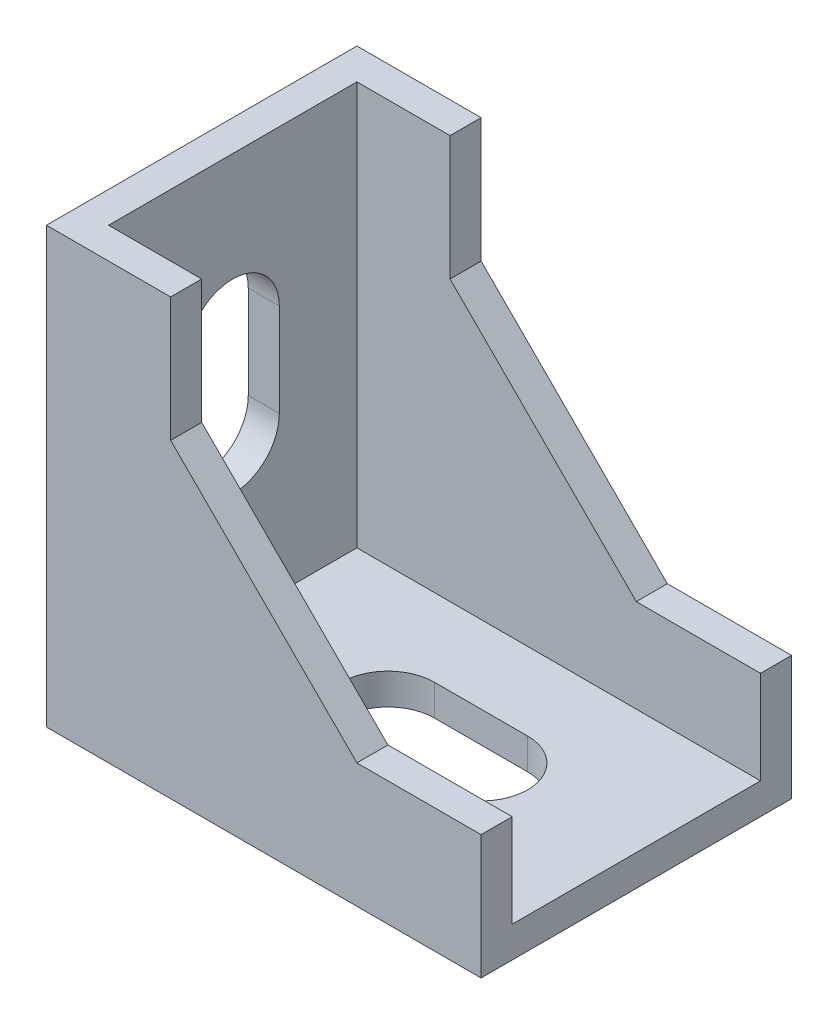
ISO-10303-21;
HEADER;
FILE_DESCRIPTION(('STEP AP214'),'2;1');
FILE_NAME('part.step','',(''),(''),'','','');
FILE_SCHEMA(('AUTOMOTIVE_DESIGN { 1 0 10303 214 1 1 1 1 }'));
ENDSEC;
DATA;
#1=APPLICATION_CONTEXT('core data for automotive mechanical design processes');
#2=APPLICATION_PROTOCOL_DEFINITION('international standard','automotive_design',2000,#1);
#3=PRODUCT_CONTEXT('',#1,'mechanical');
#4=PRODUCT('Part','Part','',(#3));
#5=PRODUCT_RELATED_PRODUCT_CATEGORY('part','',(#4));
#6=PRODUCT_DEFINITION_FORMATION('','',#4);
#7=PRODUCT_DEFINITION_CONTEXT('part definition',#1,'design');
#8=PRODUCT_DEFINITION('design','',#6,#7);
#9=PRODUCT_DEFINITION_SHAPE('','',#8);
#10=(LENGTH_UNIT() NAMED_UNIT(*) SI_UNIT(.MILLI.,.METRE.));
#11=(NAMED_UNIT(*) PLANE_ANGLE_UNIT() SI_UNIT($,.RADIAN.));
#12=(NAMED_UNIT(*) SI_UNIT($,.STERADIAN.) SOLID_ANGLE_UNIT());
#13=UNCERTAINTY_MEASURE_WITH_UNIT(LENGTH_MEASURE(1.E-05),#10,'distance_accuracy_value','');
#14=(GEOMETRIC_REPRESENTATION_CONTEXT(3) GLOBAL_UNCERTAINTY_ASSIGNED_CONTEXT((#13)) GLOBAL_UNIT_ASSIGNED_CONTEXT((#10,
#11,#12)) REPRESENTATION_CONTEXT('',''));
#15=CARTESIAN_POINT('',(0.,0.,0.));
#16=DIRECTION('',(0.,0.,1.));
#17=DIRECTION('',(1.,0.,0.));
#18=AXIS2_PLACEMENT_3D('',#15,#16,#17);
#19=CARTESIAN_POINT('',(28.,8.,20.));
#20=DIRECTION('',(-1.,0.,0.));
#21=DIRECTION('',(0.,-1.,0.));
#22=AXIS2_PLACEMENT_3D('',#19,#20,#21);
#23=PLANE('',#22);
#24=DIRECTION('',(0.,-1.,0.));
#25=VECTOR('',#24,1.);
#26=CARTESIAN_POINT('',(28.,0.,2.));
#27=LINE('',#26,#25);
#28=CARTESIAN_POINT('',(28.,8.,2.));
#29=VERTEX_POINT('',#28);
#30=CARTESIAN_POINT('',(28.,2.,2.));
#31=VERTEX_POINT('',#30);
#32=EDGE_CURVE('E290',#29,#31,#27,.T.);
#33=ORIENTED_EDGE('',*,*,#32,.T.);
#34=DIRECTION('',(0.,0.,-1.));
#35=VECTOR('',#34,1.);
#36=CARTESIAN_POINT('',(28.,2.,0.));
#37=LINE('',#36,#35);
#38=CARTESIAN_POINT('',(28.,2.,18.));
#39=VERTEX_POINT('',#38);
#40=EDGE_CURVE('E281',#39,#31,#37,.T.);
#41=ORIENTED_EDGE('',*,*,#40,.F.);
#42=DIRECTION('',(0.,-1.,0.));
#43=VECTOR('',#42,1.);
#44=CARTESIAN_POINT('',(28.,0.,18.));
#45=LINE('',#44,#43);
#46=CARTESIAN_POINT('',(28.,8.,18.));
#47=VERTEX_POINT('',#46);
#48=EDGE_CURVE('E286',#47,#39,#45,.T.);
#49=ORIENTED_EDGE('',*,*,#48,.F.);
#50=DIRECTION('',(0.,0.,-1.));
#51=VECTOR('',#50,1.);
#52=CARTESIAN_POINT('',(28.,8.,20.));
#53=LINE('',#52,#51);
#54=CARTESIAN_POINT('',(28.,8.,20.));
#55=VERTEX_POINT('',#54);
#56=EDGE_CURVE('E54',#55,#47,#53,.T.);
#57=ORIENTED_EDGE('',*,*,#56,.F.);
#58=DIRECTION('',(0.,1.,0.));
#59=VECTOR('',#58,1.);
#60=CARTESIAN_POINT('',(28.,8.,20.));
#61=LINE('',#60,#59);
#62=CARTESIAN_POINT('',(28.,0.,20.));
#63=VERTEX_POINT('',#62);
#64=EDGE_CURVE('E345',#63,#55,#61,.T.);
#65=ORIENTED_EDGE('',*,*,#64,.F.);
#66=DIRECTION('',(0.,0.,-1.));
#67=VECTOR('',#66,1.);
#68=CARTESIAN_POINT('',(28.,0.,20.));
#69=LINE('',#68,#67);
#70=CARTESIAN_POINT('',(28.,0.,0.));
#71=VERTEX_POINT('',#70);
#72=EDGE_CURVE('E11',#63,#71,#69,.T.);
#73=ORIENTED_EDGE('',*,*,#72,.T.);
#74=DIRECTION('',(0.,1.,0.));
#75=VECTOR('',#74,1.);
#76=CARTESIAN_POINT('',(28.,8.,0.));
#77=LINE('',#76,#75);
#78=CARTESIAN_POINT('',(28.,8.,0.));
#79=VERTEX_POINT('',#78);
#80=EDGE_CURVE('E368',#71,#79,#77,.T.);
#81=ORIENTED_EDGE('',*,*,#80,.T.);
#82=EDGE_CURVE('E410',#29,#79,#53,.T.);
#83=ORIENTED_EDGE('',*,*,#82,.F.);
#84=EDGE_LOOP('',(#33,#41,#49,#57,#65,#73,#81,#83));
#85=FACE_BOUND('',#84,.T.);
#86=ADVANCED_FACE('F45',(#85),#23,.F.);
#87=CARTESIAN_POINT('',(20.,8.,20.));
#88=DIRECTION('',(0.,-1.,0.));
#89=DIRECTION('',(1.,0.,0.));
#90=AXIS2_PLACEMENT_3D('',#87,#88,#89);
#91=PLANE('',#90);
#92=DIRECTION('',(-1.,0.,0.));
#93=VECTOR('',#92,1.);
#94=CARTESIAN_POINT('',(20.,8.,2.));
#95=LINE('',#94,#93);
#96=CARTESIAN_POINT('',(20.,8.,2.));
#97=VERTEX_POINT('',#96);
#98=EDGE_CURVE('E337',#29,#97,#95,.T.);
#99=ORIENTED_EDGE('',*,*,#98,.F.);
#100=ORIENTED_EDGE('',*,*,#82,.T.);
#101=DIRECTION('',(-1.,0.,0.));
#102=VECTOR('',#101,1.);
#103=CARTESIAN_POINT('',(20.,8.,0.));
#104=LINE('',#103,#102);
#105=CARTESIAN_POINT('',(20.,8.,0.));
#106=VERTEX_POINT('',#105);
#107=EDGE_CURVE('E372',#79,#106,#104,.T.);
#108=ORIENTED_EDGE('',*,*,#107,.T.);
#109=DIRECTION('',(0.,0.,-1.));
#110=VECTOR('',#109,1.);
#111=CARTESIAN_POINT('',(20.,8.,20.));
#112=LINE('',#111,#110);
#113=EDGE_CURVE('E406',#97,#106,#112,.T.);
#114=ORIENTED_EDGE('',*,*,#113,.F.);
#115=EDGE_LOOP('',(#99,#100,#108,#114));
#116=FACE_BOUND('',#115,.T.);
#117=ADVANCED_FACE('F420',(#116),#91,.F.);
#118=CARTESIAN_POINT('',(8.,20.,20.));
#119=DIRECTION('',(-0.707106781186548,-0.707106781186547,0.));
#120=DIRECTION('',(0.707106781186547,-0.707106781186548,0.));
#121=AXIS2_PLACEMENT_3D('',#118,#119,#120);
#122=PLANE('',#121);
#123=DIRECTION('',(-0.707106781186547,0.707106781186548,0.));
#124=VECTOR('',#123,1.);
#125=CARTESIAN_POINT('',(8.,20.,2.));
#126=LINE('',#125,#124);
#127=CARTESIAN_POINT('',(8.,20.,2.));
#128=VERTEX_POINT('',#127);
#129=EDGE_CURVE('E334',#97,#128,#126,.T.);
#130=ORIENTED_EDGE('',*,*,#129,.F.);
#131=ORIENTED_EDGE('',*,*,#113,.T.);
#132=DIRECTION('',(-0.707106781186547,0.707106781186548,0.));
#133=VECTOR('',#132,1.);
#134=CARTESIAN_POINT('',(8.,20.,0.));
#135=LINE('',#134,#133);
#136=CARTESIAN_POINT('',(8.,20.,0.));
#137=VERTEX_POINT('',#136);
#138=EDGE_CURVE('E376',#106,#137,#135,.T.);
#139=ORIENTED_EDGE('',*,*,#138,.T.);
#140=DIRECTION('',(0.,0.,-1.));
#141=VECTOR('',#140,1.);
#142=CARTESIAN_POINT('',(8.,20.,20.));
#143=LINE('',#142,#141);
#144=EDGE_CURVE('E401',#128,#137,#143,.T.);
#145=ORIENTED_EDGE('',*,*,#144,.F.);
#146=EDGE_LOOP('',(#130,#131,#139,#145));
#147=FACE_BOUND('',#146,.T.);
#148=ADVANCED_FACE('F434',(#147),#122,.F.);
#149=CARTESIAN_POINT('',(8.,28.,20.));
#150=DIRECTION('',(-1.,0.,0.));
#151=DIRECTION('',(0.,0.,1.));
#152=AXIS2_PLACEMENT_3D('',#149,#150,#151);
#153=PLANE('',#152);
#154=DIRECTION('',(0.,1.,0.));
#155=VECTOR('',#154,1.);
#156=CARTESIAN_POINT('',(8.,28.,2.));
#157=LINE('',#156,#155);
#158=CARTESIAN_POINT('',(7.99999999999999,28.,2.));
#159=VERTEX_POINT('',#158);
#160=EDGE_CURVE('E331',#128,#159,#157,.T.);
#161=ORIENTED_EDGE('',*,*,#160,.F.);
#162=ORIENTED_EDGE('',*,*,#144,.T.);
#163=DIRECTION('',(0.,1.,0.));
#164=VECTOR('',#163,1.);
#165=CARTESIAN_POINT('',(8.,28.,0.));
#166=LINE('',#165,#164);
#167=CARTESIAN_POINT('',(8.,28.,0.));
#168=VERTEX_POINT('',#167);
#169=EDGE_CURVE('E380',#137,#168,#166,.T.);
#170=ORIENTED_EDGE('',*,*,#169,.T.);
#171=DIRECTION('',(0.,0.,-1.));
#172=VECTOR('',#171,1.);
#173=CARTESIAN_POINT('',(8.,28.,20.));
#174=LINE('',#173,#172);
#175=EDGE_CURVE('E396',#159,#168,#174,.T.);
#176=ORIENTED_EDGE('',*,*,#175,.F.);
#177=EDGE_LOOP('',(#161,#162,#170,#176));
#178=FACE_BOUND('',#177,.T.);
#179=ADVANCED_FACE('F445',(#178),#153,.F.);
#180=CARTESIAN_POINT('',(0.,28.,20.));
#181=DIRECTION('',(0.,-1.,0.));
#182=DIRECTION('',(1.,0.,0.));
#183=AXIS2_PLACEMENT_3D('',#180,#181,#182);
#184=PLANE('',#183);
#185=DIRECTION('',(1.,0.,0.));
#186=VECTOR('',#185,1.);
#187=CARTESIAN_POINT('',(-28.5286749809475,28.,2.));
#188=LINE('',#187,#186);
#189=CARTESIAN_POINT('',(2.000000064,28.,2.));
#190=VERTEX_POINT('',#189);
#191=EDGE_CURVE('E250',#190,#159,#188,.T.);
#192=ORIENTED_EDGE('',*,*,#191,.T.);
#193=ORIENTED_EDGE('',*,*,#175,.T.);
#194=DIRECTION('',(-1.,0.,0.));
#195=VECTOR('',#194,1.);
#196=CARTESIAN_POINT('',(0.,28.,0.));
#197=LINE('',#196,#195);
#198=CARTESIAN_POINT('',(0.,28.,0.));
#199=VERTEX_POINT('',#198);
#200=EDGE_CURVE('E384',#168,#199,#197,.T.);
#201=ORIENTED_EDGE('',*,*,#200,.T.);
#202=DIRECTION('',(0.,0.,-1.));
#203=VECTOR('',#202,1.);
#204=CARTESIAN_POINT('',(0.,28.,20.));
#205=LINE('',#204,#203);
#206=CARTESIAN_POINT('',(0.,28.,20.));
#207=VERTEX_POINT('',#206);
#208=EDGE_CURVE('E392',#207,#199,#205,.T.);
#209=ORIENTED_EDGE('',*,*,#208,.F.);
#210=DIRECTION('',(-1.,0.,0.));
#211=VECTOR('',#210,1.);
#212=CARTESIAN_POINT('',(0.,28.,20.));
#213=LINE('',#212,#211);
#214=CARTESIAN_POINT('',(8.,28.,20.));
#215=VERTEX_POINT('',#214);
#216=EDGE_CURVE('E358',#215,#207,#213,.T.);
#217=ORIENTED_EDGE('',*,*,#216,.F.);
#218=CARTESIAN_POINT('',(7.99999999999999,28.,18.));
#219=VERTEX_POINT('',#218);
#220=EDGE_CURVE('E397',#215,#219,#174,.T.);
#221=ORIENTED_EDGE('',*,*,#220,.T.);
#222=DIRECTION('',(1.,0.,0.));
#223=VECTOR('',#222,1.);
#224=CARTESIAN_POINT('',(-28.5286749809475,28.,18.));
#225=LINE('',#224,#223);
#226=CARTESIAN_POINT('',(2.00000006399999,28.,18.));
#227=VERTEX_POINT('',#226);
#228=EDGE_CURVE('E289',#227,#219,#225,.T.);
#229=ORIENTED_EDGE('',*,*,#228,.F.);
#230=DIRECTION('',(0.,0.,-1.));
#231=VECTOR('',#230,1.);
#232=CARTESIAN_POINT('',(2.000000064,28.,0.));
#233=LINE('',#232,#231);
#234=EDGE_CURVE('E285',#227,#190,#233,.T.);
#235=ORIENTED_EDGE('',*,*,#234,.T.);
#236=EDGE_LOOP('',(#192,#193,#201,#209,#217,#221,#229,#235));
#237=FACE_BOUND('',#236,.T.);
#238=ADVANCED_FACE('F440',(#237),#184,.F.);
#239=CARTESIAN_POINT('',(0.,0.,20.));
#240=DIRECTION('',(0.,1.,0.));
#241=DIRECTION('',(0.,0.,1.));
#242=AXIS2_PLACEMENT_3D('',#239,#240,#241);
#243=PLANE('',#242);
#244=DIRECTION('',(1.,0.,0.));
#245=VECTOR('',#244,1.);
#246=CARTESIAN_POINT('',(0.,0.,7.));
#247=LINE('',#246,#245);
#248=CARTESIAN_POINT('',(12.,-1.25233157177718E-13,7.));
#249=VERTEX_POINT('',#248);
#250=CARTESIAN_POINT('',(18.,-1.87849735766576E-13,7.));
#251=VERTEX_POINT('',#250);
#252=EDGE_CURVE('E234',#249,#251,#247,.T.);
#253=ORIENTED_EDGE('',*,*,#252,.F.);
#254=CARTESIAN_POINT('',(12.,-1.25233157177718E-13,10.));
#255=DIRECTION('',(0.,-1.,0.));
#256=DIRECTION('',(0.,0.,-1.));
#257=AXIS2_PLACEMENT_3D('',#254,#255,#256);
#258=CIRCLE('',#257,3.);
#259=CARTESIAN_POINT('',(12.,0.,13.));
#260=VERTEX_POINT('',#259);
#261=EDGE_CURVE('E204',#260,#249,#258,.T.);
#262=ORIENTED_EDGE('',*,*,#261,.F.);
#263=DIRECTION('',(1.,0.,0.));
#264=VECTOR('',#263,1.);
#265=CARTESIAN_POINT('',(0.,0.,13.));
#266=LINE('',#265,#264);
#267=CARTESIAN_POINT('',(18.,-1.87849735766576E-13,13.));
#268=VERTEX_POINT('',#267);
#269=EDGE_CURVE('E61',#260,#268,#266,.T.);
#270=ORIENTED_EDGE('',*,*,#269,.T.);
#271=CARTESIAN_POINT('',(18.,-1.87849735766576E-13,10.));
#272=DIRECTION('',(0.,-1.,0.));
#273=DIRECTION('',(0.,0.,-1.));
#274=AXIS2_PLACEMENT_3D('',#271,#272,#273);
#275=CIRCLE('',#274,3.);
#276=EDGE_CURVE('E217',#268,#251,#275,.F.);
#277=ORIENTED_EDGE('',*,*,#276,.T.);
#278=EDGE_LOOP('',(#253,#262,#270,#277));
#279=FACE_BOUND('',#278,.T.);
#280=DIRECTION('',(1.,0.,0.));
#281=VECTOR('',#280,1.);
#282=CARTESIAN_POINT('',(0.,0.,0.));
#283=LINE('',#282,#281);
#284=CARTESIAN_POINT('',(0.,0.,0.));
#285=VERTEX_POINT('',#284);
#286=EDGE_CURVE('E340',#285,#71,#283,.T.);
#287=ORIENTED_EDGE('',*,*,#286,.T.);
#288=ORIENTED_EDGE('',*,*,#72,.F.);
#289=DIRECTION('',(1.,0.,0.));
#290=VECTOR('',#289,1.);
#291=CARTESIAN_POINT('',(0.,0.,20.));
#292=LINE('',#291,#290);
#293=CARTESIAN_POINT('',(0.,0.,20.));
#294=VERTEX_POINT('',#293);
#295=EDGE_CURVE('E341',#294,#63,#292,.T.);
#296=ORIENTED_EDGE('',*,*,#295,.F.);
#297=DIRECTION('',(0.,0.,-1.));
#298=VECTOR('',#297,1.);
#299=CARTESIAN_POINT('',(0.,0.,20.));
#300=LINE('',#299,#298);
#301=EDGE_CURVE('E364',#294,#285,#300,.T.);
#302=ORIENTED_EDGE('',*,*,#301,.T.);
#303=EDGE_LOOP('',(#287,#288,#296,#302));
#304=FACE_BOUND('',#303,.T.);
#305=ADVANCED_FACE('F47',(#279,#304),#243,.F.);
#306=ORIENTED_EDGE('',*,*,#56,.T.);
#307=DIRECTION('',(-1.,0.,0.));
#308=VECTOR('',#307,1.);
#309=CARTESIAN_POINT('',(20.,8.,18.));
#310=LINE('',#309,#308);
#311=CARTESIAN_POINT('',(20.,8.,18.));
#312=VERTEX_POINT('',#311);
#313=EDGE_CURVE('E327',#47,#312,#310,.T.);
#314=ORIENTED_EDGE('',*,*,#313,.T.);
#315=CARTESIAN_POINT('',(20.,8.,20.));
#316=VERTEX_POINT('',#315);
#317=EDGE_CURVE('E407',#316,#312,#112,.T.);
#318=ORIENTED_EDGE('',*,*,#317,.F.);
#319=DIRECTION('',(-1.,0.,0.));
#320=VECTOR('',#319,1.);
#321=CARTESIAN_POINT('',(20.,8.,20.));
#322=LINE('',#321,#320);
#323=EDGE_CURVE('E349',#55,#316,#322,.T.);
#324=ORIENTED_EDGE('',*,*,#323,.F.);
#325=EDGE_LOOP('',(#306,#314,#318,#324));
#326=FACE_BOUND('',#325,.T.);
#327=ADVANCED_FACE('F469',(#326),#91,.F.);
#328=ORIENTED_EDGE('',*,*,#317,.T.);
#329=DIRECTION('',(-0.707106781186547,0.707106781186548,0.));
#330=VECTOR('',#329,1.);
#331=CARTESIAN_POINT('',(8.,20.,18.));
#332=LINE('',#331,#330);
#333=CARTESIAN_POINT('',(8.,20.,18.));
#334=VERTEX_POINT('',#333);
#335=EDGE_CURVE('E323',#312,#334,#332,.T.);
#336=ORIENTED_EDGE('',*,*,#335,.T.);
#337=CARTESIAN_POINT('',(8.,20.,20.));
#338=VERTEX_POINT('',#337);
#339=EDGE_CURVE('E402',#338,#334,#143,.T.);
#340=ORIENTED_EDGE('',*,*,#339,.F.);
#341=DIRECTION('',(-0.707106781186547,0.707106781186548,0.));
#342=VECTOR('',#341,1.);
#343=CARTESIAN_POINT('',(8.,20.,20.));
#344=LINE('',#343,#342);
#345=EDGE_CURVE('E352',#316,#338,#344,.T.);
#346=ORIENTED_EDGE('',*,*,#345,.F.);
#347=EDGE_LOOP('',(#328,#336,#340,#346));
#348=FACE_BOUND('',#347,.T.);
#349=ADVANCED_FACE('F466',(#348),#122,.F.);
#350=ORIENTED_EDGE('',*,*,#339,.T.);
#351=DIRECTION('',(0.,1.,0.));
#352=VECTOR('',#351,1.);
#353=CARTESIAN_POINT('',(8.,28.,18.));
#354=LINE('',#353,#352);
#355=EDGE_CURVE('E306',#334,#219,#354,.T.);
#356=ORIENTED_EDGE('',*,*,#355,.T.);
#357=ORIENTED_EDGE('',*,*,#220,.F.);
#358=DIRECTION('',(0.,1.,0.));
#359=VECTOR('',#358,1.);
#360=CARTESIAN_POINT('',(8.,28.,20.));
#361=LINE('',#360,#359);
#362=EDGE_CURVE('E355',#338,#215,#361,.T.);
#363=ORIENTED_EDGE('',*,*,#362,.F.);
#364=EDGE_LOOP('',(#350,#356,#357,#363));
#365=FACE_BOUND('',#364,.T.);
#366=ADVANCED_FACE('F460',(#365),#153,.F.);
#367=CARTESIAN_POINT('',(0.,0.,20.));
#368=DIRECTION('',(1.,0.,0.));
#369=DIRECTION('',(0.,0.,-1.));
#370=AXIS2_PLACEMENT_3D('',#367,#368,#369);
#371=PLANE('',#370);
#372=DIRECTION('',(0.,1.,0.));
#373=VECTOR('',#372,1.);
#374=CARTESIAN_POINT('',(0.,0.,7.));
#375=LINE('',#374,#373);
#376=CARTESIAN_POINT('',(0.,12.,7.));
#377=VERTEX_POINT('',#376);
#378=CARTESIAN_POINT('',(0.,18.,7.));
#379=VERTEX_POINT('',#378);
#380=EDGE_CURVE('E243',#377,#379,#375,.T.);
#381=ORIENTED_EDGE('',*,*,#380,.T.);
#382=CARTESIAN_POINT('',(0.,18.,10.));
#383=DIRECTION('',(1.,0.,0.));
#384=DIRECTION('',(0.,0.,-1.));
#385=AXIS2_PLACEMENT_3D('',#382,#383,#384);
#386=CIRCLE('',#385,3.);
#387=CARTESIAN_POINT('',(0.,18.,13.));
#388=VERTEX_POINT('',#387);
#389=EDGE_CURVE('E239',#388,#379,#386,.F.);
#390=ORIENTED_EDGE('',*,*,#389,.F.);
#391=DIRECTION('',(0.,1.,0.));
#392=VECTOR('',#391,1.);
#393=CARTESIAN_POINT('',(0.,0.,13.));
#394=LINE('',#393,#392);
#395=CARTESIAN_POINT('',(0.,12.,13.));
#396=VERTEX_POINT('',#395);
#397=EDGE_CURVE('E242',#396,#388,#394,.T.);
#398=ORIENTED_EDGE('',*,*,#397,.F.);
#399=CARTESIAN_POINT('',(0.,12.,10.));
#400=DIRECTION('',(1.,0.,0.));
#401=DIRECTION('',(0.,0.,-1.));
#402=AXIS2_PLACEMENT_3D('',#399,#400,#401);
#403=CIRCLE('',#402,3.);
#404=EDGE_CURVE('E246',#396,#377,#403,.T.);
#405=ORIENTED_EDGE('',*,*,#404,.T.);
#406=EDGE_LOOP('',(#381,#390,#398,#405));
#407=FACE_BOUND('',#406,.T.);
#408=DIRECTION('',(0.,-1.,0.));
#409=VECTOR('',#408,1.);
#410=CARTESIAN_POINT('',(0.,0.,0.));
#411=LINE('',#410,#409);
#412=EDGE_CURVE('E346',#199,#285,#411,.T.);
#413=ORIENTED_EDGE('',*,*,#412,.T.);
#414=ORIENTED_EDGE('',*,*,#301,.F.);
#415=DIRECTION('',(0.,-1.,0.));
#416=VECTOR('',#415,1.);
#417=CARTESIAN_POINT('',(0.,0.,20.));
#418=LINE('',#417,#416);
#419=EDGE_CURVE('E361',#207,#294,#418,.T.);
#420=ORIENTED_EDGE('',*,*,#419,.F.);
#421=ORIENTED_EDGE('',*,*,#208,.T.);
#422=EDGE_LOOP('',(#413,#414,#420,#421));
#423=FACE_BOUND('',#422,.T.);
#424=ADVANCED_FACE('F449',(#407,#423),#371,.F.);
#425=CARTESIAN_POINT('',(0.,0.,20.));
#426=DIRECTION('',(0.,0.,-1.));
#427=DIRECTION('',(-1.,0.,0.));
#428=AXIS2_PLACEMENT_3D('',#425,#426,#427);
#429=PLANE('',#428);
#430=ORIENTED_EDGE('',*,*,#295,.T.);
#431=ORIENTED_EDGE('',*,*,#64,.T.);
#432=ORIENTED_EDGE('',*,*,#323,.T.);
#433=ORIENTED_EDGE('',*,*,#345,.T.);
#434=ORIENTED_EDGE('',*,*,#362,.T.);
#435=ORIENTED_EDGE('',*,*,#216,.T.);
#436=ORIENTED_EDGE('',*,*,#419,.T.);
#437=EDGE_LOOP('',(#430,#431,#432,#433,#434,#435,#436));
#438=FACE_BOUND('',#437,.T.);
#439=ADVANCED_FACE('F454',(#438),#429,.F.);
#440=CARTESIAN_POINT('',(0.,0.,0.));
#441=DIRECTION('',(0.,0.,-1.));
#442=DIRECTION('',(-1.,0.,0.));
#443=AXIS2_PLACEMENT_3D('',#440,#441,#442);
#444=PLANE('',#443);
#445=ORIENTED_EDGE('',*,*,#286,.F.);
#446=ORIENTED_EDGE('',*,*,#412,.F.);
#447=ORIENTED_EDGE('',*,*,#200,.F.);
#448=ORIENTED_EDGE('',*,*,#169,.F.);
#449=ORIENTED_EDGE('',*,*,#138,.F.);
#450=ORIENTED_EDGE('',*,*,#107,.F.);
#451=ORIENTED_EDGE('',*,*,#80,.F.);
#452=EDGE_LOOP('',(#445,#446,#447,#448,#449,#450,#451));
#453=FACE_BOUND('',#452,.T.);
#454=ADVANCED_FACE('F428',(#453),#444,.T.);
#455=CARTESIAN_POINT('',(-28.5286749809475,0.,2.));
#456=DIRECTION('',(0.,0.,1.));
#457=DIRECTION('',(0.,-1.,0.));
#458=AXIS2_PLACEMENT_3D('',#455,#456,#457);
#459=PLANE('',#458);
#460=ORIENTED_EDGE('',*,*,#98,.T.);
#461=ORIENTED_EDGE('',*,*,#129,.T.);
#462=ORIENTED_EDGE('',*,*,#160,.T.);
#463=ORIENTED_EDGE('',*,*,#191,.F.);
#464=DIRECTION('',(0.,-1.,0.));
#465=VECTOR('',#464,1.);
#466=CARTESIAN_POINT('',(2.000000064,0.,2.));
#467=LINE('',#466,#465);
#468=CARTESIAN_POINT('',(2.00000006399999,1.99999999999999,2.));
#469=VERTEX_POINT('',#468);
#470=EDGE_CURVE('E302',#190,#469,#467,.T.);
#471=ORIENTED_EDGE('',*,*,#470,.T.);
#472=DIRECTION('',(1.,0.,0.));
#473=VECTOR('',#472,1.);
#474=CARTESIAN_POINT('',(-28.5286749809475,1.99999999999998,2.));
#475=LINE('',#474,#473);
#476=EDGE_CURVE('E299',#469,#31,#475,.T.);
#477=ORIENTED_EDGE('',*,*,#476,.T.);
#478=ORIENTED_EDGE('',*,*,#32,.F.);
#479=EDGE_LOOP('',(#460,#461,#462,#463,#471,#477,#478));
#480=FACE_BOUND('',#479,.T.);
#481=ADVANCED_FACE('F478',(#480),#459,.T.);
#482=CARTESIAN_POINT('',(-28.5286749809475,0.,18.));
#483=DIRECTION('',(0.,0.,1.));
#484=DIRECTION('',(0.,-1.,0.));
#485=AXIS2_PLACEMENT_3D('',#482,#483,#484);
#486=PLANE('',#485);
#487=ORIENTED_EDGE('',*,*,#48,.T.);
#488=DIRECTION('',(1.,0.,0.));
#489=VECTOR('',#488,1.);
#490=CARTESIAN_POINT('',(-28.5286749809475,1.99999999999998,18.));
#491=LINE('',#490,#489);
#492=CARTESIAN_POINT('',(2.00000006399999,1.99999999999999,18.));
#493=VERTEX_POINT('',#492);
#494=EDGE_CURVE('E298',#493,#39,#491,.T.);
#495=ORIENTED_EDGE('',*,*,#494,.F.);
#496=DIRECTION('',(0.,-1.,0.));
#497=VECTOR('',#496,1.);
#498=CARTESIAN_POINT('',(2.000000064,0.,18.));
#499=LINE('',#498,#497);
#500=EDGE_CURVE('E295',#227,#493,#499,.T.);
#501=ORIENTED_EDGE('',*,*,#500,.F.);
#502=ORIENTED_EDGE('',*,*,#228,.T.);
#503=ORIENTED_EDGE('',*,*,#355,.F.);
#504=ORIENTED_EDGE('',*,*,#335,.F.);
#505=ORIENTED_EDGE('',*,*,#313,.F.);
#506=EDGE_LOOP('',(#487,#495,#501,#502,#503,#504,#505));
#507=FACE_BOUND('',#506,.T.);
#508=ADVANCED_FACE('F463',(#507),#486,.F.);
#509=CARTESIAN_POINT('',(-28.5286749809475,1.99999999999998,0.));
#510=DIRECTION('',(0.,-1.,0.));
#511=DIRECTION('',(1.,0.,0.));
#512=AXIS2_PLACEMENT_3D('',#509,#510,#511);
#513=PLANE('',#512);
#514=DIRECTION('',(-1.,0.,0.));
#515=VECTOR('',#514,1.);
#516=CARTESIAN_POINT('',(0.,2.000000064,7.));
#517=LINE('',#516,#515);
#518=CARTESIAN_POINT('',(18.,2.00000006399981,7.));
#519=VERTEX_POINT('',#518);
#520=CARTESIAN_POINT('',(12.,1.99999999999999,7.));
#521=VERTEX_POINT('',#520);
#522=EDGE_CURVE('E69',#519,#521,#517,.T.);
#523=ORIENTED_EDGE('',*,*,#522,.F.);
#524=CARTESIAN_POINT('',(18.,2.00000006399981,10.));
#525=DIRECTION('',(0.,-1.,0.));
#526=DIRECTION('',(0.,0.,-1.));
#527=AXIS2_PLACEMENT_3D('',#524,#525,#526);
#528=CIRCLE('',#527,3.);
#529=CARTESIAN_POINT('',(18.,2.00000006399981,13.));
#530=VERTEX_POINT('',#529);
#531=EDGE_CURVE('E215',#519,#530,#528,.T.);
#532=ORIENTED_EDGE('',*,*,#531,.T.);
#533=DIRECTION('',(-1.,0.,0.));
#534=VECTOR('',#533,1.);
#535=CARTESIAN_POINT('',(0.,2.000000064,13.));
#536=LINE('',#535,#534);
#537=CARTESIAN_POINT('',(12.,2.00000006399987,13.));
#538=VERTEX_POINT('',#537);
#539=EDGE_CURVE('E197',#530,#538,#536,.T.);
#540=ORIENTED_EDGE('',*,*,#539,.T.);
#541=CARTESIAN_POINT('',(12.,2.00000006399987,10.));
#542=DIRECTION('',(0.,-1.,0.));
#543=DIRECTION('',(0.,0.,-1.));
#544=AXIS2_PLACEMENT_3D('',#541,#542,#543);
#545=CIRCLE('',#544,3.);
#546=EDGE_CURVE('E207',#521,#538,#545,.F.);
#547=ORIENTED_EDGE('',*,*,#546,.F.);
#548=EDGE_LOOP('',(#523,#532,#540,#547));
#549=FACE_BOUND('',#548,.T.);
#550=ORIENTED_EDGE('',*,*,#494,.T.);
#551=ORIENTED_EDGE('',*,*,#40,.T.);
#552=ORIENTED_EDGE('',*,*,#476,.F.);
#553=DIRECTION('',(0.,0.,-1.));
#554=VECTOR('',#553,1.);
#555=CARTESIAN_POINT('',(2.000000064,1.99999999999999,0.));
#556=LINE('',#555,#554);
#557=EDGE_CURVE('E294',#493,#469,#556,.T.);
#558=ORIENTED_EDGE('',*,*,#557,.F.);
#559=EDGE_LOOP('',(#550,#551,#552,#558));
#560=FACE_BOUND('',#559,.T.);
#561=ADVANCED_FACE('F212',(#549,#560),#513,.F.);
#562=CARTESIAN_POINT('',(2.000000064,0.,0.));
#563=DIRECTION('',(-1.,0.,0.));
#564=DIRECTION('',(0.,0.,1.));
#565=AXIS2_PLACEMENT_3D('',#562,#563,#564);
#566=PLANE('',#565);
#567=DIRECTION('',(0.,-1.,0.));
#568=VECTOR('',#567,1.);
#569=CARTESIAN_POINT('',(2.000000064,0.,7.));
#570=LINE('',#569,#568);
#571=CARTESIAN_POINT('',(2.000000064,18.,7.));
#572=VERTEX_POINT('',#571);
#573=CARTESIAN_POINT('',(2.000000064,12.,7.));
#574=VERTEX_POINT('',#573);
#575=EDGE_CURVE('E254',#572,#574,#570,.T.);
#576=ORIENTED_EDGE('',*,*,#575,.T.);
#577=CARTESIAN_POINT('',(2.000000064,12.,10.));
#578=DIRECTION('',(1.,0.,0.));
#579=DIRECTION('',(0.,0.,-1.));
#580=AXIS2_PLACEMENT_3D('',#577,#578,#579);
#581=CIRCLE('',#580,3.);
#582=CARTESIAN_POINT('',(2.000000064,12.,13.));
#583=VERTEX_POINT('',#582);
#584=EDGE_CURVE('E238',#574,#583,#581,.F.);
#585=ORIENTED_EDGE('',*,*,#584,.T.);
#586=DIRECTION('',(0.,-1.,0.));
#587=VECTOR('',#586,1.);
#588=CARTESIAN_POINT('',(2.000000064,0.,13.));
#589=LINE('',#588,#587);
#590=CARTESIAN_POINT('',(2.000000064,18.,13.));
#591=VERTEX_POINT('',#590);
#592=EDGE_CURVE('E262',#591,#583,#589,.T.);
#593=ORIENTED_EDGE('',*,*,#592,.F.);
#594=CARTESIAN_POINT('',(2.000000064,18.,10.));
#595=DIRECTION('',(1.,0.,0.));
#596=DIRECTION('',(0.,0.,-1.));
#597=AXIS2_PLACEMENT_3D('',#594,#595,#596);
#598=CIRCLE('',#597,3.);
#599=EDGE_CURVE('E258',#572,#591,#598,.T.);
#600=ORIENTED_EDGE('',*,*,#599,.F.);
#601=EDGE_LOOP('',(#576,#585,#593,#600));
#602=FACE_BOUND('',#601,.T.);
#603=ORIENTED_EDGE('',*,*,#234,.F.);
#604=ORIENTED_EDGE('',*,*,#500,.T.);
#605=ORIENTED_EDGE('',*,*,#557,.T.);
#606=ORIENTED_EDGE('',*,*,#470,.F.);
#607=EDGE_LOOP('',(#603,#604,#605,#606));
#608=FACE_BOUND('',#607,.T.);
#609=ADVANCED_FACE('F476',(#602,#608),#566,.F.);
#610=CARTESIAN_POINT('',(-13.4164078649987,0.,7.));
#611=DIRECTION('',(0.,0.,1.));
#612=DIRECTION('',(0.,-1.,0.));
#613=AXIS2_PLACEMENT_3D('',#610,#611,#612);
#614=PLANE('',#613);
#615=DIRECTION('',(1.,0.,0.));
#616=VECTOR('',#615,1.);
#617=CARTESIAN_POINT('',(-13.4164078649987,12.,7.));
#618=LINE('',#617,#616);
#619=EDGE_CURVE('E265',#377,#574,#618,.T.);
#620=ORIENTED_EDGE('',*,*,#619,.T.);
#621=ORIENTED_EDGE('',*,*,#575,.F.);
#622=DIRECTION('',(1.,0.,0.));
#623=VECTOR('',#622,1.);
#624=CARTESIAN_POINT('',(-13.4164078649987,18.,7.));
#625=LINE('',#624,#623);
#626=EDGE_CURVE('E273',#379,#572,#625,.T.);
#627=ORIENTED_EDGE('',*,*,#626,.F.);
#628=ORIENTED_EDGE('',*,*,#380,.F.);
#629=EDGE_LOOP('',(#620,#621,#627,#628));
#630=FACE_BOUND('',#629,.T.);
#631=ADVANCED_FACE('F507',(#630),#614,.T.);
#632=CARTESIAN_POINT('',(-13.4164078649987,18.,10.));
#633=DIRECTION('',(1.,0.,0.));
#634=DIRECTION('',(0.,0.,-1.));
#635=AXIS2_PLACEMENT_3D('',#632,#633,#634);
#636=CYLINDRICAL_SURFACE('',#635,3.);
#637=ORIENTED_EDGE('',*,*,#389,.T.);
#638=ORIENTED_EDGE('',*,*,#626,.T.);
#639=ORIENTED_EDGE('',*,*,#599,.T.);
#640=DIRECTION('',(1.,0.,0.));
#641=VECTOR('',#640,1.);
#642=CARTESIAN_POINT('',(-13.4164078649987,18.,13.));
#643=LINE('',#642,#641);
#644=EDGE_CURVE('E270',#388,#591,#643,.T.);
#645=ORIENTED_EDGE('',*,*,#644,.F.);
#646=EDGE_LOOP('',(#637,#638,#639,#645));
#647=FACE_BOUND('',#646,.T.);
#648=ADVANCED_FACE('F512',(#647),#636,.F.);
#649=CARTESIAN_POINT('',(-13.4164078649987,0.,13.));
#650=DIRECTION('',(0.,0.,1.));
#651=DIRECTION('',(1.,0.,0.));
#652=AXIS2_PLACEMENT_3D('',#649,#650,#651);
#653=PLANE('',#652);
#654=ORIENTED_EDGE('',*,*,#397,.T.);
#655=ORIENTED_EDGE('',*,*,#644,.T.);
#656=ORIENTED_EDGE('',*,*,#592,.T.);
#657=DIRECTION('',(1.,0.,0.));
#658=VECTOR('',#657,1.);
#659=CARTESIAN_POINT('',(-13.4164078649987,12.,13.));
#660=LINE('',#659,#658);
#661=EDGE_CURVE('E266',#396,#583,#660,.T.);
#662=ORIENTED_EDGE('',*,*,#661,.F.);
#663=EDGE_LOOP('',(#654,#655,#656,#662));
#664=FACE_BOUND('',#663,.T.);
#665=ADVANCED_FACE('F527',(#664),#653,.F.);
#666=CARTESIAN_POINT('',(-13.4164078649987,12.,10.));
#667=DIRECTION('',(1.,0.,0.));
#668=DIRECTION('',(0.,0.,-1.));
#669=AXIS2_PLACEMENT_3D('',#666,#667,#668);
#670=CYLINDRICAL_SURFACE('',#669,3.);
#671=ORIENTED_EDGE('',*,*,#661,.T.);
#672=ORIENTED_EDGE('',*,*,#584,.F.);
#673=ORIENTED_EDGE('',*,*,#619,.F.);
#674=ORIENTED_EDGE('',*,*,#404,.F.);
#675=EDGE_LOOP('',(#671,#672,#673,#674));
#676=FACE_BOUND('',#675,.T.);
#677=ADVANCED_FACE('F523',(#676),#670,.F.);
#678=CARTESIAN_POINT('',(-1.42516368762748E-13,-13.4164078649987,7.));
#679=DIRECTION('',(0.,0.,1.));
#680=DIRECTION('',(-1.,0.,0.));
#681=AXIS2_PLACEMENT_3D('',#678,#679,#680);
#682=PLANE('',#681);
#683=DIRECTION('',(0.,1.,0.));
#684=VECTOR('',#683,1.);
#685=CARTESIAN_POINT('',(11.9999999999999,-13.4164078649989,7.));
#686=LINE('',#685,#684);
#687=EDGE_CURVE('E203',#249,#521,#686,.T.);
#688=ORIENTED_EDGE('',*,*,#687,.F.);
#689=ORIENTED_EDGE('',*,*,#252,.T.);
#690=DIRECTION('',(0.,1.,0.));
#691=VECTOR('',#690,1.);
#692=CARTESIAN_POINT('',(17.9999999999999,-13.4164078649989,7.));
#693=LINE('',#692,#691);
#694=EDGE_CURVE('E223',#251,#519,#693,.T.);
#695=ORIENTED_EDGE('',*,*,#694,.T.);
#696=ORIENTED_EDGE('',*,*,#522,.T.);
#697=EDGE_LOOP('',(#688,#689,#695,#696));
#698=FACE_BOUND('',#697,.T.);
#699=ADVANCED_FACE('F540',(#698),#682,.T.);
#700=CARTESIAN_POINT('',(17.9999999999999,-13.4164078649989,10.));
#701=DIRECTION('',(0.,1.,0.));
#702=DIRECTION('',(0.,0.,-1.));
#703=AXIS2_PLACEMENT_3D('',#700,#701,#702);
#704=CYLINDRICAL_SURFACE('',#703,3.);
#705=ORIENTED_EDGE('',*,*,#276,.F.);
#706=DIRECTION('',(0.,1.,0.));
#707=VECTOR('',#706,1.);
#708=CARTESIAN_POINT('',(17.9999999999999,-13.4164078649989,13.));
#709=LINE('',#708,#707);
#710=EDGE_CURVE('E218',#268,#530,#709,.T.);
#711=ORIENTED_EDGE('',*,*,#710,.T.);
#712=ORIENTED_EDGE('',*,*,#531,.F.);
#713=ORIENTED_EDGE('',*,*,#694,.F.);
#714=EDGE_LOOP('',(#705,#711,#712,#713));
#715=FACE_BOUND('',#714,.T.);
#716=ADVANCED_FACE('F545',(#715),#704,.F.);
#717=CARTESIAN_POINT('',(-1.41504446735095E-13,-13.4164078649987,13.));
#718=DIRECTION('',(0.,0.,1.));
#719=DIRECTION('',(0.,1.,0.));
#720=AXIS2_PLACEMENT_3D('',#717,#718,#719);
#721=PLANE('',#720);
#722=ORIENTED_EDGE('',*,*,#269,.F.);
#723=DIRECTION('',(0.,1.,0.));
#724=VECTOR('',#723,1.);
#725=CARTESIAN_POINT('',(11.9999999999999,-13.4164078649989,13.));
#726=LINE('',#725,#724);
#727=EDGE_CURVE('E193',#260,#538,#726,.T.);
#728=ORIENTED_EDGE('',*,*,#727,.T.);
#729=ORIENTED_EDGE('',*,*,#539,.F.);
#730=ORIENTED_EDGE('',*,*,#710,.F.);
#731=EDGE_LOOP('',(#722,#728,#729,#730));
#732=FACE_BOUND('',#731,.T.);
#733=ADVANCED_FACE('F195',(#732),#721,.F.);
#734=CARTESIAN_POINT('',(11.9999999999999,-13.4164078649989,10.));
#735=DIRECTION('',(0.,1.,0.));
#736=DIRECTION('',(0.,0.,-1.));
#737=AXIS2_PLACEMENT_3D('',#734,#735,#736);
#738=CYLINDRICAL_SURFACE('',#737,3.);
#739=ORIENTED_EDGE('',*,*,#727,.F.);
#740=ORIENTED_EDGE('',*,*,#261,.T.);
#741=ORIENTED_EDGE('',*,*,#687,.T.);
#742=ORIENTED_EDGE('',*,*,#546,.T.);
#743=EDGE_LOOP('',(#739,#740,#741,#742));
#744=FACE_BOUND('',#743,.T.);
#745=ADVANCED_FACE('F208',(#744),#738,.F.);
#746=CLOSED_SHELL('',(#86,#117,#148,#179,#238,#305,#327,#349,#366,#424,#439,#454,#481,#508,#561,
#609,#631,#648,#665,#677,#699,#716,#733,#745));
#747=MANIFOLD_SOLID_BREP('B2',#746);
#748=ADVANCED_BREP_SHAPE_REPRESENTATION('',(#18,#747),#14);
#749=SHAPE_DEFINITION_REPRESENTATION(#9,#748);
ENDSEC;
END-ISO-10303-21;
